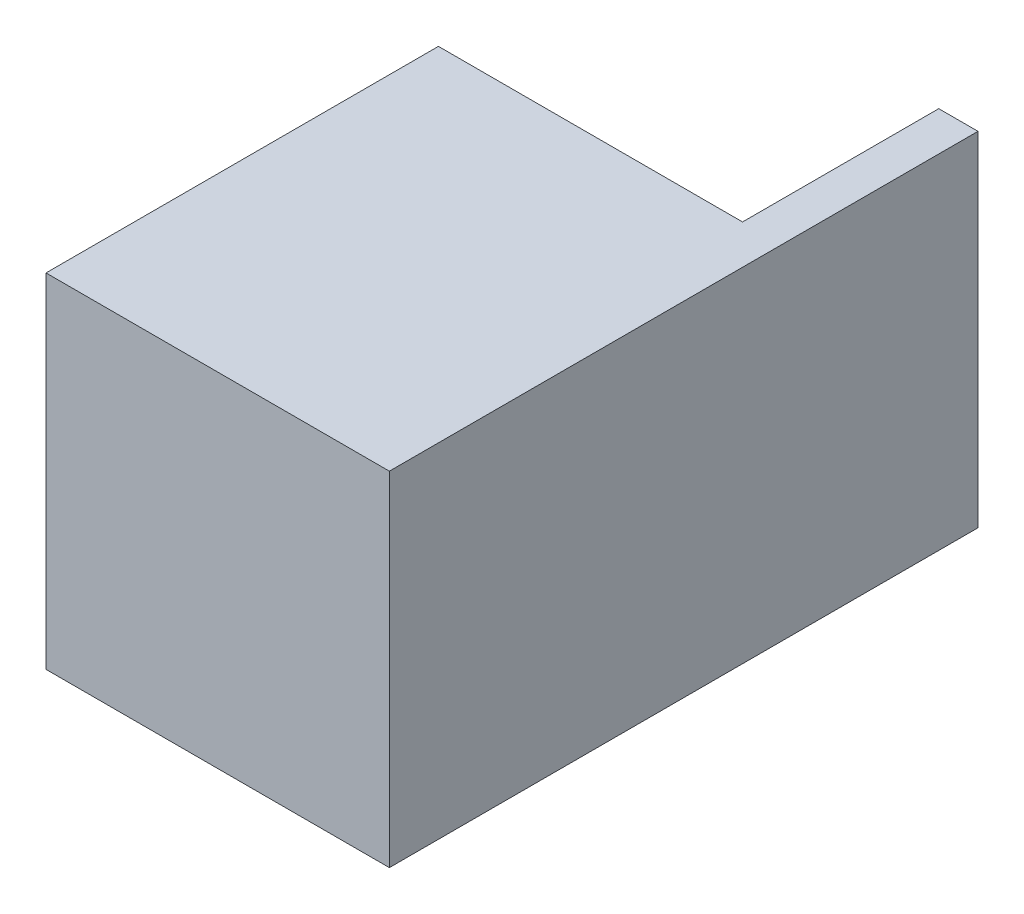
ISO-10303-21;
HEADER;
FILE_DESCRIPTION(('STEP AP214'),'2;1');
FILE_NAME('part.step','',(''),(''),'','','');
FILE_SCHEMA(('AUTOMOTIVE_DESIGN { 1 0 10303 214 1 1 1 1 }'));
ENDSEC;
DATA;
#1=APPLICATION_CONTEXT('core data for automotive mechanical design processes');
#2=APPLICATION_PROTOCOL_DEFINITION('international standard','automotive_design',2000,#1);
#3=PRODUCT_CONTEXT('',#1,'mechanical');
#4=PRODUCT('Part','Part','',(#3));
#5=PRODUCT_RELATED_PRODUCT_CATEGORY('part','',(#4));
#6=PRODUCT_DEFINITION_FORMATION('','',#4);
#7=PRODUCT_DEFINITION_CONTEXT('part definition',#1,'design');
#8=PRODUCT_DEFINITION('design','',#6,#7);
#9=PRODUCT_DEFINITION_SHAPE('','',#8);
#10=(LENGTH_UNIT() NAMED_UNIT(*) SI_UNIT(.MILLI.,.METRE.));
#11=(NAMED_UNIT(*) PLANE_ANGLE_UNIT() SI_UNIT($,.RADIAN.));
#12=(NAMED_UNIT(*) SI_UNIT($,.STERADIAN.) SOLID_ANGLE_UNIT());
#13=UNCERTAINTY_MEASURE_WITH_UNIT(LENGTH_MEASURE(1.E-05),#10,'distance_accuracy_value','');
#14=(GEOMETRIC_REPRESENTATION_CONTEXT(3) GLOBAL_UNCERTAINTY_ASSIGNED_CONTEXT((#13)) GLOBAL_UNIT_ASSIGNED_CONTEXT((#10,
#11,#12)) REPRESENTATION_CONTEXT('',''));
#15=CARTESIAN_POINT('',(0.,0.,0.));
#16=DIRECTION('',(0.,0.,1.));
#17=DIRECTION('',(1.,0.,0.));
#18=AXIS2_PLACEMENT_3D('',#15,#16,#17);
#19=CARTESIAN_POINT('',(0.,0.,0.));
#20=DIRECTION('',(0.,0.,1.));
#21=DIRECTION('',(1.,0.,0.));
#22=AXIS2_PLACEMENT_3D('',#19,#20,#21);
#23=PLANE('',#22);
#24=DIRECTION('',(0.,1.,0.));
#25=VECTOR('',#24,1.);
#26=CARTESIAN_POINT('',(13.5,13.5,0.));
#27=LINE('',#26,#25);
#28=CARTESIAN_POINT('',(13.5,-13.5,0.));
#29=VERTEX_POINT('',#28);
#30=CARTESIAN_POINT('',(13.5,17.5,0.));
#31=VERTEX_POINT('',#30);
#32=EDGE_CURVE('E131',#29,#31,#27,.T.);
#33=ORIENTED_EDGE('',*,*,#32,.F.);
#34=DIRECTION('',(1.,0.,0.));
#35=VECTOR('',#34,1.);
#36=CARTESIAN_POINT('',(13.5,-13.5,0.));
#37=LINE('',#36,#35);
#38=CARTESIAN_POINT('',(-17.5,-13.5,0.));
#39=VERTEX_POINT('',#38);
#40=EDGE_CURVE('E66',#39,#29,#37,.T.);
#41=ORIENTED_EDGE('',*,*,#40,.F.);
#42=DIRECTION('',(0.,-1.,0.));
#43=VECTOR('',#42,1.);
#44=CARTESIAN_POINT('',(-17.5,17.5,0.));
#45=LINE('',#44,#43);
#46=CARTESIAN_POINT('',(-17.5,17.5,0.));
#47=VERTEX_POINT('',#46);
#48=EDGE_CURVE('E163',#47,#39,#45,.T.);
#49=ORIENTED_EDGE('',*,*,#48,.F.);
#50=DIRECTION('',(-1.,0.,0.));
#51=VECTOR('',#50,1.);
#52=CARTESIAN_POINT('',(-17.5,17.5,0.));
#53=LINE('',#52,#51);
#54=EDGE_CURVE('E61',#31,#47,#53,.T.);
#55=ORIENTED_EDGE('',*,*,#54,.F.);
#56=EDGE_LOOP('',(#33,#41,#49,#55));
#57=FACE_BOUND('',#56,.T.);
#58=ADVANCED_FACE('F45',(#57),#23,.F.);
#59=CARTESIAN_POINT('',(17.5,17.5,40.));
#60=DIRECTION('',(-1.,0.,0.));
#61=DIRECTION('',(0.,-1.,0.));
#62=AXIS2_PLACEMENT_3D('',#59,#60,#61);
#63=PLANE('',#62);
#64=DIRECTION('',(0.,0.,-1.));
#65=VECTOR('',#64,1.);
#66=CARTESIAN_POINT('',(17.5,-17.5,40.));
#67=LINE('',#66,#65);
#68=CARTESIAN_POINT('',(17.5,-17.5,40.));
#69=VERTEX_POINT('',#68);
#70=CARTESIAN_POINT('',(17.5,-17.5,-20.));
#71=VERTEX_POINT('',#70);
#72=EDGE_CURVE('E104',#69,#71,#67,.T.);
#73=ORIENTED_EDGE('',*,*,#72,.T.);
#74=DIRECTION('',(0.,-1.,0.));
#75=VECTOR('',#74,1.);
#76=CARTESIAN_POINT('',(17.5,-17.5,-20.));
#77=LINE('',#76,#75);
#78=CARTESIAN_POINT('',(17.5,17.5,-20.));
#79=VERTEX_POINT('',#78);
#80=EDGE_CURVE('E108',#79,#71,#77,.T.);
#81=ORIENTED_EDGE('',*,*,#80,.F.);
#82=DIRECTION('',(0.,0.,-1.));
#83=VECTOR('',#82,1.);
#84=CARTESIAN_POINT('',(17.5,17.5,40.));
#85=LINE('',#84,#83);
#86=CARTESIAN_POINT('',(17.5,17.5,40.));
#87=VERTEX_POINT('',#86);
#88=EDGE_CURVE('E11',#87,#79,#85,.T.);
#89=ORIENTED_EDGE('',*,*,#88,.F.);
#90=DIRECTION('',(0.,1.,0.));
#91=VECTOR('',#90,1.);
#92=CARTESIAN_POINT('',(17.5,17.5,40.));
#93=LINE('',#92,#91);
#94=EDGE_CURVE('E110',#69,#87,#93,.T.);
#95=ORIENTED_EDGE('',*,*,#94,.F.);
#96=EDGE_LOOP('',(#73,#81,#89,#95));
#97=FACE_BOUND('',#96,.T.);
#98=ADVANCED_FACE('F47',(#97),#63,.F.);
#99=CARTESIAN_POINT('',(-17.5,17.5,40.));
#100=DIRECTION('',(0.,-1.,0.));
#101=DIRECTION('',(0.,0.,-1.));
#102=AXIS2_PLACEMENT_3D('',#99,#100,#101);
#103=PLANE('',#102);
#104=ORIENTED_EDGE('',*,*,#88,.T.);
#105=DIRECTION('',(1.,0.,0.));
#106=VECTOR('',#105,1.);
#107=CARTESIAN_POINT('',(17.5,17.5,-20.));
#108=LINE('',#107,#106);
#109=CARTESIAN_POINT('',(13.5,17.5,-20.));
#110=VERTEX_POINT('',#109);
#111=EDGE_CURVE('E129',#110,#79,#108,.T.);
#112=ORIENTED_EDGE('',*,*,#111,.F.);
#113=DIRECTION('',(0.,0.,1.));
#114=VECTOR('',#113,1.);
#115=CARTESIAN_POINT('',(13.5,17.5,-20.));
#116=LINE('',#115,#114);
#117=EDGE_CURVE('E146',#110,#31,#116,.T.);
#118=ORIENTED_EDGE('',*,*,#117,.T.);
#119=ORIENTED_EDGE('',*,*,#54,.T.);
#120=DIRECTION('',(0.,0.,-1.));
#121=VECTOR('',#120,1.);
#122=CARTESIAN_POINT('',(-17.5,17.5,40.));
#123=LINE('',#122,#121);
#124=CARTESIAN_POINT('',(-17.5,17.5,40.));
#125=VERTEX_POINT('',#124);
#126=EDGE_CURVE('E54',#125,#47,#123,.T.);
#127=ORIENTED_EDGE('',*,*,#126,.F.);
#128=DIRECTION('',(-1.,0.,0.));
#129=VECTOR('',#128,1.);
#130=CARTESIAN_POINT('',(-17.5,17.5,40.));
#131=LINE('',#130,#129);
#132=EDGE_CURVE('E162',#87,#125,#131,.T.);
#133=ORIENTED_EDGE('',*,*,#132,.F.);
#134=EDGE_LOOP('',(#104,#112,#118,#119,#127,#133));
#135=FACE_BOUND('',#134,.T.);
#136=ADVANCED_FACE('F190',(#135),#103,.F.);
#137=CARTESIAN_POINT('',(-17.5,17.5,40.));
#138=DIRECTION('',(1.,0.,0.));
#139=DIRECTION('',(0.,1.,0.));
#140=AXIS2_PLACEMENT_3D('',#137,#138,#139);
#141=PLANE('',#140);
#142=ORIENTED_EDGE('',*,*,#48,.T.);
#143=DIRECTION('',(0.,0.,1.));
#144=VECTOR('',#143,1.);
#145=CARTESIAN_POINT('',(-17.5,-13.5,-20.));
#146=LINE('',#145,#144);
#147=CARTESIAN_POINT('',(-17.5,-13.5,-20.));
#148=VERTEX_POINT('',#147);
#149=EDGE_CURVE('E156',#148,#39,#146,.T.);
#150=ORIENTED_EDGE('',*,*,#149,.F.);
#151=DIRECTION('',(0.,1.,0.));
#152=VECTOR('',#151,1.);
#153=CARTESIAN_POINT('',(-17.5,-13.5,-20.));
#154=LINE('',#153,#152);
#155=CARTESIAN_POINT('',(-17.5,-17.5,-20.));
#156=VERTEX_POINT('',#155);
#157=EDGE_CURVE('E124',#156,#148,#154,.T.);
#158=ORIENTED_EDGE('',*,*,#157,.F.);
#159=DIRECTION('',(0.,0.,-1.));
#160=VECTOR('',#159,1.);
#161=CARTESIAN_POINT('',(-17.5,-17.5,40.));
#162=LINE('',#161,#160);
#163=CARTESIAN_POINT('',(-17.5,-17.5,40.));
#164=VERTEX_POINT('',#163);
#165=EDGE_CURVE('E114',#164,#156,#162,.T.);
#166=ORIENTED_EDGE('',*,*,#165,.F.);
#167=DIRECTION('',(0.,-1.,0.));
#168=VECTOR('',#167,1.);
#169=CARTESIAN_POINT('',(-17.5,17.5,40.));
#170=LINE('',#169,#168);
#171=EDGE_CURVE('E166',#125,#164,#170,.T.);
#172=ORIENTED_EDGE('',*,*,#171,.F.);
#173=ORIENTED_EDGE('',*,*,#126,.T.);
#174=EDGE_LOOP('',(#142,#150,#158,#166,#172,#173));
#175=FACE_BOUND('',#174,.T.);
#176=ADVANCED_FACE('F181',(#175),#141,.F.);
#177=CARTESIAN_POINT('',(-17.5,-17.5,40.));
#178=DIRECTION('',(0.,1.,0.));
#179=DIRECTION('',(0.,0.,1.));
#180=AXIS2_PLACEMENT_3D('',#177,#178,#179);
#181=PLANE('',#180);
#182=ORIENTED_EDGE('',*,*,#165,.T.);
#183=DIRECTION('',(-1.,0.,0.));
#184=VECTOR('',#183,1.);
#185=CARTESIAN_POINT('',(-17.5,-17.5,-20.));
#186=LINE('',#185,#184);
#187=EDGE_CURVE('E118',#71,#156,#186,.T.);
#188=ORIENTED_EDGE('',*,*,#187,.F.);
#189=ORIENTED_EDGE('',*,*,#72,.F.);
#190=DIRECTION('',(1.,0.,0.));
#191=VECTOR('',#190,1.);
#192=CARTESIAN_POINT('',(-17.5,-17.5,40.));
#193=LINE('',#192,#191);
#194=EDGE_CURVE('E115',#164,#69,#193,.T.);
#195=ORIENTED_EDGE('',*,*,#194,.F.);
#196=EDGE_LOOP('',(#182,#188,#189,#195));
#197=FACE_BOUND('',#196,.T.);
#198=ADVANCED_FACE('F119',(#197),#181,.F.);
#199=CARTESIAN_POINT('',(0.,0.,40.));
#200=DIRECTION('',(0.,0.,1.));
#201=DIRECTION('',(1.,0.,0.));
#202=AXIS2_PLACEMENT_3D('',#199,#200,#201);
#203=PLANE('',#202);
#204=ORIENTED_EDGE('',*,*,#94,.T.);
#205=ORIENTED_EDGE('',*,*,#132,.T.);
#206=ORIENTED_EDGE('',*,*,#171,.T.);
#207=ORIENTED_EDGE('',*,*,#194,.T.);
#208=EDGE_LOOP('',(#204,#205,#206,#207));
#209=FACE_BOUND('',#208,.T.);
#210=ADVANCED_FACE('F193',(#209),#203,.T.);
#211=CARTESIAN_POINT('',(13.5,-13.5,-20.));
#212=DIRECTION('',(0.,-1.,0.));
#213=DIRECTION('',(0.,0.,-1.));
#214=AXIS2_PLACEMENT_3D('',#211,#212,#213);
#215=PLANE('',#214);
#216=ORIENTED_EDGE('',*,*,#40,.T.);
#217=DIRECTION('',(0.,0.,1.));
#218=VECTOR('',#217,1.);
#219=CARTESIAN_POINT('',(13.5,-13.5,-20.));
#220=LINE('',#219,#218);
#221=CARTESIAN_POINT('',(13.5,-13.5,-20.));
#222=VERTEX_POINT('',#221);
#223=EDGE_CURVE('E152',#222,#29,#220,.T.);
#224=ORIENTED_EDGE('',*,*,#223,.F.);
#225=DIRECTION('',(1.,0.,0.));
#226=VECTOR('',#225,1.);
#227=CARTESIAN_POINT('',(-13.5,-13.5,-20.));
#228=LINE('',#227,#226);
#229=EDGE_CURVE('E138',#148,#222,#228,.T.);
#230=ORIENTED_EDGE('',*,*,#229,.F.);
#231=ORIENTED_EDGE('',*,*,#149,.T.);
#232=EDGE_LOOP('',(#216,#224,#230,#231));
#233=FACE_BOUND('',#232,.T.);
#234=ADVANCED_FACE('F207',(#233),#215,.F.);
#235=CARTESIAN_POINT('',(13.5,13.5,-20.));
#236=DIRECTION('',(1.,0.,0.));
#237=DIRECTION('',(0.,0.,-1.));
#238=AXIS2_PLACEMENT_3D('',#235,#236,#237);
#239=PLANE('',#238);
#240=ORIENTED_EDGE('',*,*,#32,.T.);
#241=ORIENTED_EDGE('',*,*,#117,.F.);
#242=DIRECTION('',(0.,1.,0.));
#243=VECTOR('',#242,1.);
#244=CARTESIAN_POINT('',(13.5,13.5,-20.));
#245=LINE('',#244,#243);
#246=EDGE_CURVE('E141',#222,#110,#245,.T.);
#247=ORIENTED_EDGE('',*,*,#246,.F.);
#248=ORIENTED_EDGE('',*,*,#223,.T.);
#249=EDGE_LOOP('',(#240,#241,#247,#248));
#250=FACE_BOUND('',#249,.T.);
#251=ADVANCED_FACE('F209',(#250),#239,.F.);
#252=CARTESIAN_POINT('',(0.,0.,-20.));
#253=DIRECTION('',(0.,0.,1.));
#254=DIRECTION('',(1.,0.,0.));
#255=AXIS2_PLACEMENT_3D('',#252,#253,#254);
#256=PLANE('',#255);
#257=ORIENTED_EDGE('',*,*,#80,.T.);
#258=ORIENTED_EDGE('',*,*,#187,.T.);
#259=ORIENTED_EDGE('',*,*,#157,.T.);
#260=ORIENTED_EDGE('',*,*,#229,.T.);
#261=ORIENTED_EDGE('',*,*,#246,.T.);
#262=ORIENTED_EDGE('',*,*,#111,.T.);
#263=EDGE_LOOP('',(#257,#258,#259,#260,#261,#262));
#264=FACE_BOUND('',#263,.T.);
#265=ADVANCED_FACE('F127',(#264),#256,.F.);
#266=CLOSED_SHELL('',(#58,#98,#136,#176,#198,#210,#234,#251,#265));
#267=MANIFOLD_SOLID_BREP('B2',#266);
#268=ADVANCED_BREP_SHAPE_REPRESENTATION('',(#18,#267),#14);
#269=SHAPE_DEFINITION_REPRESENTATION(#9,#268);
ENDSEC;
END-ISO-10303-21;
